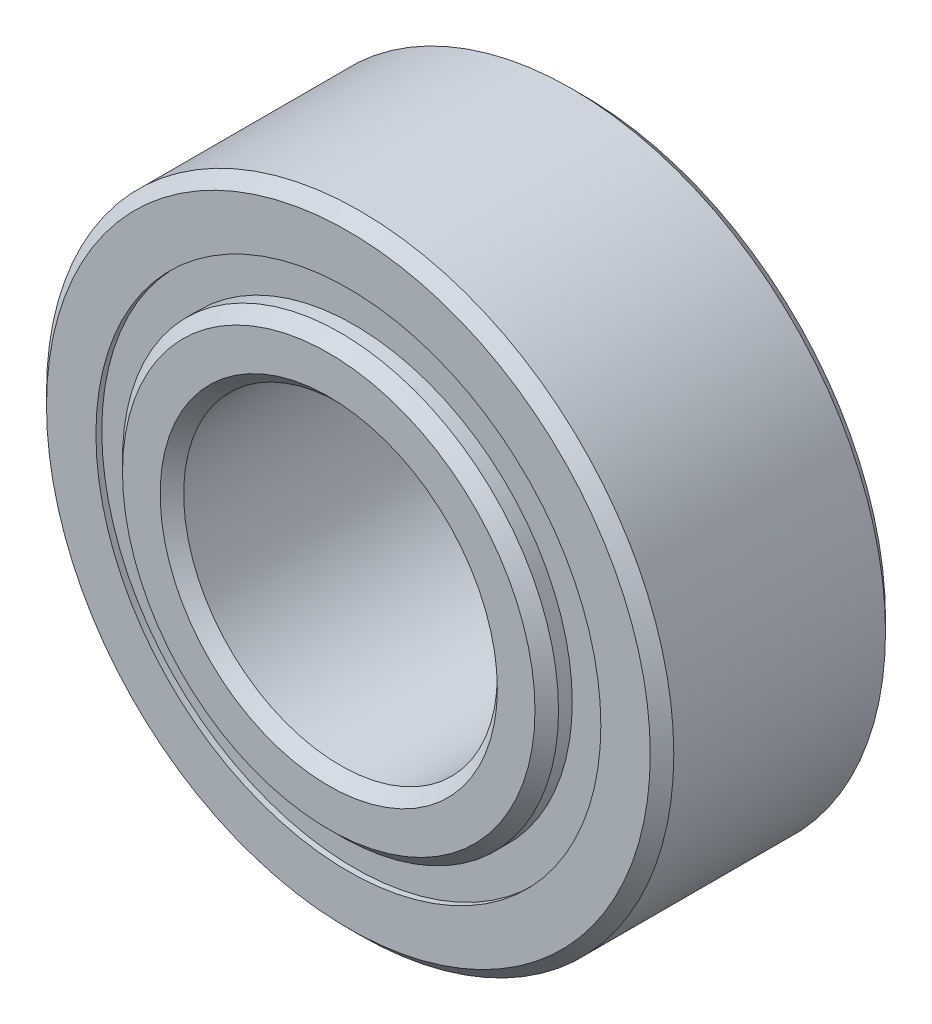
ISO-10303-21;
HEADER;
FILE_DESCRIPTION(('STEP AP214'),'2;1');
FILE_NAME('part.step','',(''),(''),'','','');
FILE_SCHEMA(('AUTOMOTIVE_DESIGN { 1 0 10303 214 1 1 1 1 }'));
ENDSEC;
DATA;
#1=APPLICATION_CONTEXT('core data for automotive mechanical design processes');
#2=APPLICATION_PROTOCOL_DEFINITION('international standard','automotive_design',2000,#1);
#3=PRODUCT_CONTEXT('',#1,'mechanical');
#4=PRODUCT('Part','Part','',(#3));
#5=PRODUCT_RELATED_PRODUCT_CATEGORY('part','',(#4));
#6=PRODUCT_DEFINITION_FORMATION('','',#4);
#7=PRODUCT_DEFINITION_CONTEXT('part definition',#1,'design');
#8=PRODUCT_DEFINITION('design','',#6,#7);
#9=PRODUCT_DEFINITION_SHAPE('','',#8);
#10=(LENGTH_UNIT() NAMED_UNIT(*) SI_UNIT(.MILLI.,.METRE.));
#11=(NAMED_UNIT(*) PLANE_ANGLE_UNIT() SI_UNIT($,.RADIAN.));
#12=(NAMED_UNIT(*) SI_UNIT($,.STERADIAN.) SOLID_ANGLE_UNIT());
#13=UNCERTAINTY_MEASURE_WITH_UNIT(LENGTH_MEASURE(1.E-05),#10,'distance_accuracy_value','');
#14=(GEOMETRIC_REPRESENTATION_CONTEXT(3) GLOBAL_UNCERTAINTY_ASSIGNED_CONTEXT((#13)) GLOBAL_UNIT_ASSIGNED_CONTEXT((#10,
#11,#12)) REPRESENTATION_CONTEXT('',''));
#15=CARTESIAN_POINT('',(0.,0.,0.));
#16=DIRECTION('',(0.,0.,1.));
#17=DIRECTION('',(1.,0.,0.));
#18=AXIS2_PLACEMENT_3D('',#15,#16,#17);
#19=CARTESIAN_POINT('',(0.,5.1114010989011,-2.2621875));
#20=DIRECTION('',(0.,0.,1.));
#21=DIRECTION('',(1.,0.,0.));
#22=AXIS2_PLACEMENT_3D('',#19,#20,#21);
#23=PLANE('',#22);
#24=CARTESIAN_POINT('',(0.,0.,-2.2621875));
#25=DIRECTION('',(0.,0.,1.));
#26=DIRECTION('',(1.,0.,0.));
#27=AXIS2_PLACEMENT_3D('',#24,#25,#26);
#28=CIRCLE('',#27,5.1114010989011);
#29=CARTESIAN_POINT('',(5.1114010989011,0.,-2.2621875));
#30=VERTEX_POINT('',#29);
#31=EDGE_CURVE('E71',#30,#30,#28,.T.);
#32=ORIENTED_EDGE('',*,*,#31,.F.);
#33=EDGE_LOOP('',(#32));
#34=FACE_BOUND('',#33,.T.);
#35=CARTESIAN_POINT('',(0.,0.,-2.2621875));
#36=DIRECTION('',(0.,0.,1.));
#37=DIRECTION('',(1.,0.,0.));
#38=AXIS2_PLACEMENT_3D('',#35,#36,#37);
#39=CIRCLE('',#38,4.41359890109897);
#40=CARTESIAN_POINT('',(4.41359890109897,0.,-2.2621875));
#41=VERTEX_POINT('',#40);
#42=EDGE_CURVE('E13',#41,#41,#39,.T.);
#43=ORIENTED_EDGE('',*,*,#42,.T.);
#44=EDGE_LOOP('',(#43));
#45=FACE_BOUND('',#44,.T.);
#46=ADVANCED_FACE('F57',(#34,#45),#23,.F.);
#47=CARTESIAN_POINT('',(0.,0.,2.38125));
#48=DIRECTION('',(0.,0.,1.));
#49=DIRECTION('',(1.,0.,0.));
#50=AXIS2_PLACEMENT_3D('',#47,#48,#49);
#51=CYLINDRICAL_SURFACE('',#50,4.41359890109897);
#52=ORIENTED_EDGE('',*,*,#42,.F.);
#53=EDGE_LOOP('',(#52));
#54=FACE_BOUND('',#53,.T.);
#55=CARTESIAN_POINT('',(0.,0.,-1.11436144103197));
#56=DIRECTION('',(0.,0.,1.));
#57=DIRECTION('',(1.,0.,0.));
#58=AXIS2_PLACEMENT_3D('',#55,#56,#57);
#59=CIRCLE('',#58,4.41359890109897);
#60=CARTESIAN_POINT('',(4.41359890109897,0.,-1.11436144103197));
#61=VERTEX_POINT('',#60);
#62=EDGE_CURVE('E63',#61,#61,#59,.T.);
#63=ORIENTED_EDGE('',*,*,#62,.T.);
#64=EDGE_LOOP('',(#63));
#65=FACE_BOUND('',#64,.T.);
#66=ADVANCED_FACE('F80',(#54,#65),#51,.F.);
#67=CARTESIAN_POINT('',(0.,5.1114010989011,-1.11436144103197));
#68=DIRECTION('',(0.,0.,-1.));
#69=DIRECTION('',(-1.,0.,0.));
#70=AXIS2_PLACEMENT_3D('',#67,#68,#69);
#71=PLANE('',#70);
#72=ORIENTED_EDGE('',*,*,#62,.F.);
#73=EDGE_LOOP('',(#72));
#74=FACE_BOUND('',#73,.T.);
#75=CARTESIAN_POINT('',(0.,0.,-1.11436144103197));
#76=DIRECTION('',(0.,0.,1.));
#77=DIRECTION('',(1.,0.,0.));
#78=AXIS2_PLACEMENT_3D('',#75,#76,#77);
#79=CIRCLE('',#78,5.1114010989011);
#80=CARTESIAN_POINT('',(5.1114010989011,0.,-1.11436144103197));
#81=VERTEX_POINT('',#80);
#82=EDGE_CURVE('E67',#81,#81,#79,.T.);
#83=ORIENTED_EDGE('',*,*,#82,.T.);
#84=EDGE_LOOP('',(#83));
#85=FACE_BOUND('',#84,.T.);
#86=ADVANCED_FACE('F84',(#74,#85),#71,.F.);
#87=CARTESIAN_POINT('',(0.,0.,2.38125));
#88=DIRECTION('',(0.,0.,1.));
#89=DIRECTION('',(1.,0.,0.));
#90=AXIS2_PLACEMENT_3D('',#87,#88,#89);
#91=CYLINDRICAL_SURFACE('',#90,5.1114010989011);
#92=ORIENTED_EDGE('',*,*,#82,.F.);
#93=EDGE_LOOP('',(#92));
#94=FACE_BOUND('',#93,.T.);
#95=ORIENTED_EDGE('',*,*,#31,.T.);
#96=EDGE_LOOP('',(#95));
#97=FACE_BOUND('',#96,.T.);
#98=ADVANCED_FACE('F77',(#94,#97),#91,.T.);
#99=CLOSED_SHELL('',(#46,#66,#86,#98));
#100=MANIFOLD_SOLID_BREP('B2',#99);
#101=CARTESIAN_POINT('',(0.,5.1114010989011,2.2621875));
#102=DIRECTION('',(0.,0.,-1.));
#103=DIRECTION('',(-1.,0.,0.));
#104=AXIS2_PLACEMENT_3D('',#101,#102,#103);
#105=PLANE('',#104);
#106=CARTESIAN_POINT('',(0.,0.,2.2621875));
#107=DIRECTION('',(0.,0.,1.));
#108=DIRECTION('',(1.,0.,0.));
#109=AXIS2_PLACEMENT_3D('',#106,#107,#108);
#110=CIRCLE('',#109,4.41359890109897);
#111=CARTESIAN_POINT('',(4.41359890109897,0.,2.2621875));
#112=VERTEX_POINT('',#111);
#113=EDGE_CURVE('E56',#112,#112,#110,.T.);
#114=ORIENTED_EDGE('',*,*,#113,.F.);
#115=EDGE_LOOP('',(#114));
#116=FACE_BOUND('',#115,.T.);
#117=CARTESIAN_POINT('',(0.,0.,2.2621875));
#118=DIRECTION('',(0.,0.,1.));
#119=DIRECTION('',(1.,0.,0.));
#120=AXIS2_PLACEMENT_3D('',#117,#118,#119);
#121=CIRCLE('',#120,5.1114010989011);
#122=CARTESIAN_POINT('',(5.1114010989011,0.,2.2621875));
#123=VERTEX_POINT('',#122);
#124=EDGE_CURVE('E145',#123,#123,#121,.T.);
#125=ORIENTED_EDGE('',*,*,#124,.T.);
#126=EDGE_LOOP('',(#125));
#127=FACE_BOUND('',#126,.T.);
#128=ADVANCED_FACE('F131',(#116,#127),#105,.F.);
#129=CARTESIAN_POINT('',(0.,0.,2.38125));
#130=DIRECTION('',(0.,0.,1.));
#131=DIRECTION('',(1.,0.,0.));
#132=AXIS2_PLACEMENT_3D('',#129,#130,#131);
#133=CYLINDRICAL_SURFACE('',#132,4.41359890109897);
#134=CARTESIAN_POINT('',(0.,0.,1.11436144103197));
#135=DIRECTION('',(0.,0.,1.));
#136=DIRECTION('',(1.,0.,0.));
#137=AXIS2_PLACEMENT_3D('',#134,#135,#136);
#138=CIRCLE('',#137,4.41359890109897);
#139=CARTESIAN_POINT('',(4.41359890109897,0.,1.11436144103197));
#140=VERTEX_POINT('',#139);
#141=EDGE_CURVE('E137',#140,#140,#138,.T.);
#142=ORIENTED_EDGE('',*,*,#141,.F.);
#143=EDGE_LOOP('',(#142));
#144=FACE_BOUND('',#143,.T.);
#145=ORIENTED_EDGE('',*,*,#113,.T.);
#146=EDGE_LOOP('',(#145));
#147=FACE_BOUND('',#146,.T.);
#148=ADVANCED_FACE('F160',(#144,#147),#133,.F.);
#149=CARTESIAN_POINT('',(0.,5.1114010989011,1.11436144103197));
#150=DIRECTION('',(0.,0.,1.));
#151=DIRECTION('',(1.,0.,0.));
#152=AXIS2_PLACEMENT_3D('',#149,#150,#151);
#153=PLANE('',#152);
#154=CARTESIAN_POINT('',(0.,0.,1.11436144103197));
#155=DIRECTION('',(0.,0.,1.));
#156=DIRECTION('',(1.,0.,0.));
#157=AXIS2_PLACEMENT_3D('',#154,#155,#156);
#158=CIRCLE('',#157,5.1114010989011);
#159=CARTESIAN_POINT('',(5.1114010989011,0.,1.11436144103197));
#160=VERTEX_POINT('',#159);
#161=EDGE_CURVE('E141',#160,#160,#158,.T.);
#162=ORIENTED_EDGE('',*,*,#161,.F.);
#163=EDGE_LOOP('',(#162));
#164=FACE_BOUND('',#163,.T.);
#165=ORIENTED_EDGE('',*,*,#141,.T.);
#166=EDGE_LOOP('',(#165));
#167=FACE_BOUND('',#166,.T.);
#168=ADVANCED_FACE('F155',(#164,#167),#153,.F.);
#169=CARTESIAN_POINT('',(0.,0.,2.38125));
#170=DIRECTION('',(0.,0.,1.));
#171=DIRECTION('',(1.,0.,0.));
#172=AXIS2_PLACEMENT_3D('',#169,#170,#171);
#173=CYLINDRICAL_SURFACE('',#172,5.1114010989011);
#174=ORIENTED_EDGE('',*,*,#124,.F.);
#175=EDGE_LOOP('',(#174));
#176=FACE_BOUND('',#175,.T.);
#177=ORIENTED_EDGE('',*,*,#161,.T.);
#178=EDGE_LOOP('',(#177));
#179=FACE_BOUND('',#178,.T.);
#180=ADVANCED_FACE('F152',(#176,#179),#173,.T.);
#181=CLOSED_SHELL('',(#128,#148,#168,#180));
#182=MANIFOLD_SOLID_BREP('B8',#181);
#183=CARTESIAN_POINT('',(-2.79932726404285,3.85294343571072,0.));
#184=DIRECTION('',(0.,0.,1.));
#185=DIRECTION('',(-0.587785252292462,0.809016994374955,0.));
#186=AXIS2_PLACEMENT_3D('',#183,#184,#185);
#187=SPHERICAL_SURFACE('',#186,1.11436144103197);
#188=CARTESIAN_POINT('',(-2.79932726404285,3.85294343571072,1.11436144103197));
#189=VERTEX_POINT('',#188);
#190=VERTEX_LOOP('',#189);
#191=FACE_BOUND('',#190,.T.);
#192=ADVANCED_FACE('F203',(#191),#187,.T.);
#193=CLOSED_SHELL('',(#192));
#194=MANIFOLD_SOLID_BREP('B51',#193);
#195=CARTESIAN_POINT('',(-4.52940665885565,1.47169343571074,0.));
#196=DIRECTION('',(0.,0.,1.));
#197=DIRECTION('',(-0.95105651629515,0.309016994374958,0.));
#198=AXIS2_PLACEMENT_3D('',#195,#196,#197);
#199=SPHERICAL_SURFACE('',#198,1.11436144103197);
#200=CARTESIAN_POINT('',(-4.52940665885565,1.47169343571074,1.11436144103197));
#201=VERTEX_POINT('',#200);
#202=VERTEX_LOOP('',#201);
#203=FACE_BOUND('',#202,.T.);
#204=ADVANCED_FACE('F228',(#203),#199,.T.);
#205=CLOSED_SHELL('',(#204));
#206=MANIFOLD_SOLID_BREP('B127',#205);
#207=CARTESIAN_POINT('',(-4.52940665885568,-1.47169343571064,0.));
#208=DIRECTION('',(0.,0.,1.));
#209=DIRECTION('',(-0.951056516295157,-0.309016994374938,0.));
#210=AXIS2_PLACEMENT_3D('',#207,#208,#209);
#211=SPHERICAL_SURFACE('',#210,1.11436144103197);
#212=CARTESIAN_POINT('',(-4.52940665885568,-1.47169343571064,1.11436144103197));
#213=VERTEX_POINT('',#212);
#214=VERTEX_LOOP('',#213);
#215=FACE_BOUND('',#214,.T.);
#216=ADVANCED_FACE('F253',(#215),#211,.T.);
#217=CLOSED_SHELL('',(#216));
#218=MANIFOLD_SOLID_BREP('B199',#217);
#219=CARTESIAN_POINT('',(-2.79932726404294,-3.85294343571066,0.));
#220=DIRECTION('',(0.,0.,1.));
#221=DIRECTION('',(-0.58778525229248,-0.809016994374942,0.));
#222=AXIS2_PLACEMENT_3D('',#219,#220,#221);
#223=SPHERICAL_SURFACE('',#222,1.11436144103197);
#224=CARTESIAN_POINT('',(-2.79932726404294,-3.85294343571066,1.11436144103197));
#225=VERTEX_POINT('',#224);
#226=VERTEX_LOOP('',#225);
#227=FACE_BOUND('',#226,.T.);
#228=ADVANCED_FACE('F277',(#227),#223,.T.);
#229=CLOSED_SHELL('',(#228));
#230=MANIFOLD_SOLID_BREP('B224',#229);
#231=CARTESIAN_POINT('',(0.,-4.7625,0.));
#232=DIRECTION('',(0.,0.,1.));
#233=DIRECTION('',(0.,-1.,0.));
#234=AXIS2_PLACEMENT_3D('',#231,#232,#233);
#235=SPHERICAL_SURFACE('',#234,1.11436144103197);
#236=CARTESIAN_POINT('',(0.,-4.7625,1.11436144103197));
#237=VERTEX_POINT('',#236);
#238=VERTEX_LOOP('',#237);
#239=FACE_BOUND('',#238,.T.);
#240=ADVANCED_FACE('F301',(#239),#235,.T.);
#241=CLOSED_SHELL('',(#240));
#242=MANIFOLD_SOLID_BREP('B249',#241);
#243=CARTESIAN_POINT('',(2.79932726404288,-3.8529434357107,0.));
#244=DIRECTION('',(0.,0.,1.));
#245=DIRECTION('',(0.587785252292469,-0.809016994374951,0.));
#246=AXIS2_PLACEMENT_3D('',#243,#244,#245);
#247=SPHERICAL_SURFACE('',#246,1.11436144103197);
#248=CARTESIAN_POINT('',(2.79932726404288,-3.8529434357107,1.11436144103197));
#249=VERTEX_POINT('',#248);
#250=VERTEX_LOOP('',#249);
#251=FACE_BOUND('',#250,.T.);
#252=ADVANCED_FACE('F326',(#251),#247,.T.);
#253=CLOSED_SHELL('',(#252));
#254=MANIFOLD_SOLID_BREP('B273',#253);
#255=CARTESIAN_POINT('',(4.52940665885566,-1.47169343571071,0.));
#256=DIRECTION('',(0.,0.,1.));
#257=DIRECTION('',(0.951056516295152,-0.309016994374952,0.));
#258=AXIS2_PLACEMENT_3D('',#255,#256,#257);
#259=SPHERICAL_SURFACE('',#258,1.11436144103197);
#260=CARTESIAN_POINT('',(4.52940665885566,-1.47169343571071,1.11436144103197));
#261=VERTEX_POINT('',#260);
#262=VERTEX_LOOP('',#261);
#263=FACE_BOUND('',#262,.T.);
#264=ADVANCED_FACE('F350',(#263),#259,.T.);
#265=CLOSED_SHELL('',(#264));
#266=MANIFOLD_SOLID_BREP('B297',#265);
#267=CARTESIAN_POINT('',(4.52940665885567,1.47169343571067,0.));
#268=DIRECTION('',(0.,0.,1.));
#269=DIRECTION('',(0.951056516295155,0.309016994374945,0.));
#270=AXIS2_PLACEMENT_3D('',#267,#268,#269);
#271=SPHERICAL_SURFACE('',#270,1.11436144103197);
#272=CARTESIAN_POINT('',(4.52940665885567,1.47169343571067,1.11436144103197));
#273=VERTEX_POINT('',#272);
#274=VERTEX_LOOP('',#273);
#275=FACE_BOUND('',#274,.T.);
#276=ADVANCED_FACE('F375',(#275),#271,.T.);
#277=CLOSED_SHELL('',(#276));
#278=MANIFOLD_SOLID_BREP('B322',#277);
#279=CARTESIAN_POINT('',(2.79932726404291,3.85294343571068,0.));
#280=DIRECTION('',(0.,0.,1.));
#281=DIRECTION('',(0.587785252292474,0.809016994374947,0.));
#282=AXIS2_PLACEMENT_3D('',#279,#280,#281);
#283=SPHERICAL_SURFACE('',#282,1.11436144103197);
#284=CARTESIAN_POINT('',(2.79932726404291,3.85294343571068,1.11436144103197));
#285=VERTEX_POINT('',#284);
#286=VERTEX_LOOP('',#285);
#287=FACE_BOUND('',#286,.T.);
#288=ADVANCED_FACE('F400',(#287),#283,.T.);
#289=CLOSED_SHELL('',(#288));
#290=MANIFOLD_SOLID_BREP('B346',#289);
#291=CARTESIAN_POINT('',(0.,4.7625,0.));
#292=DIRECTION('',(0.,0.,1.));
#293=DIRECTION('',(0.,1.,0.));
#294=AXIS2_PLACEMENT_3D('',#291,#292,#293);
#295=SPHERICAL_SURFACE('',#294,1.11436144103197);
#296=CARTESIAN_POINT('',(0.,4.7625,1.11436144103197));
#297=VERTEX_POINT('',#296);
#298=VERTEX_LOOP('',#297);
#299=FACE_BOUND('',#298,.T.);
#300=ADVANCED_FACE('F428',(#299),#295,.T.);
#301=CLOSED_SHELL('',(#300));
#302=MANIFOLD_SOLID_BREP('B371',#301);
#303=CARTESIAN_POINT('',(0.,0.,2.540635));
#304=DIRECTION('',(0.,0.,-1.));
#305=DIRECTION('',(-1.,0.,0.));
#306=AXIS2_PLACEMENT_3D('',#303,#304,#305);
#307=CONICAL_SURFACE('',#306,4.41359890109897,0.785398163397447);
#308=CARTESIAN_POINT('',(0.,0.,2.77876));
#309=DIRECTION('',(0.,0.,1.));
#310=DIRECTION('',(1.,0.,0.));
#311=AXIS2_PLACEMENT_3D('',#308,#309,#310);
#312=CIRCLE('',#311,4.17547390109897);
#313=CARTESIAN_POINT('',(4.17547390109897,0.,2.77876));
#314=VERTEX_POINT('',#313);
#315=EDGE_CURVE('E489',#314,#314,#312,.T.);
#316=ORIENTED_EDGE('',*,*,#315,.F.);
#317=EDGE_LOOP('',(#316));
#318=FACE_BOUND('',#317,.T.);
#319=CARTESIAN_POINT('',(0.,0.,2.540635));
#320=DIRECTION('',(0.,0.,1.));
#321=DIRECTION('',(1.,0.,0.));
#322=AXIS2_PLACEMENT_3D('',#319,#320,#321);
#323=CIRCLE('',#322,4.41359890109897);
#324=CARTESIAN_POINT('',(4.41359890109897,0.,2.540635));
#325=VERTEX_POINT('',#324);
#326=EDGE_CURVE('E427',#325,#325,#323,.T.);
#327=ORIENTED_EDGE('',*,*,#326,.T.);
#328=EDGE_LOOP('',(#327));
#329=FACE_BOUND('',#328,.T.);
#330=ADVANCED_FACE('F455',(#318,#329),#307,.T.);
#331=CARTESIAN_POINT('',(0.,0.,2.38125));
#332=DIRECTION('',(0.,0.,1.));
#333=DIRECTION('',(1.,0.,0.));
#334=AXIS2_PLACEMENT_3D('',#331,#332,#333);
#335=CYLINDRICAL_SURFACE('',#334,4.41359890109897);
#336=ORIENTED_EDGE('',*,*,#326,.F.);
#337=EDGE_LOOP('',(#336));
#338=FACE_BOUND('',#337,.T.);
#339=CARTESIAN_POINT('',(0.,0.,1.05833333333333));
#340=DIRECTION('',(0.,0.,1.));
#341=DIRECTION('',(1.,0.,0.));
#342=AXIS2_PLACEMENT_3D('',#339,#340,#341);
#343=CIRCLE('',#342,4.41359890109897);
#344=CARTESIAN_POINT('',(4.41359890109897,0.,1.05833333333333));
#345=VERTEX_POINT('',#344);
#346=EDGE_CURVE('E461',#345,#345,#343,.T.);
#347=ORIENTED_EDGE('',*,*,#346,.T.);
#348=EDGE_LOOP('',(#347));
#349=FACE_BOUND('',#348,.T.);
#350=ADVANCED_FACE('F496',(#338,#349),#335,.T.);
#351=CARTESIAN_POINT('',(0.,0.,0.));
#352=DIRECTION('',(0.,0.,1.));
#353=DIRECTION('',(1.,0.,0.));
#354=AXIS2_PLACEMENT_3D('',#351,#352,#353);
#355=TOROIDAL_SURFACE('',#354,4.76250000000006,1.11436144103196);
#356=ORIENTED_EDGE('',*,*,#346,.F.);
#357=EDGE_LOOP('',(#356));
#358=FACE_BOUND('',#357,.T.);
#359=CARTESIAN_POINT('',(0.,0.,-1.05833333333333));
#360=DIRECTION('',(0.,0.,1.));
#361=DIRECTION('',(1.,0.,0.));
#362=AXIS2_PLACEMENT_3D('',#359,#360,#361);
#363=CIRCLE('',#362,4.41359890109897);
#364=CARTESIAN_POINT('',(4.41359890109897,0.,-1.05833333333333));
#365=VERTEX_POINT('',#364);
#366=EDGE_CURVE('E465',#365,#365,#363,.T.);
#367=ORIENTED_EDGE('',*,*,#366,.T.);
#368=EDGE_LOOP('',(#367));
#369=FACE_BOUND('',#368,.T.);
#370=ADVANCED_FACE('F500',(#358,#369),#355,.F.);
#371=CARTESIAN_POINT('',(0.,0.,2.38125));
#372=DIRECTION('',(0.,0.,1.));
#373=DIRECTION('',(1.,0.,0.));
#374=AXIS2_PLACEMENT_3D('',#371,#372,#373);
#375=CYLINDRICAL_SURFACE('',#374,4.41359890109897);
#376=ORIENTED_EDGE('',*,*,#366,.F.);
#377=EDGE_LOOP('',(#376));
#378=FACE_BOUND('',#377,.T.);
#379=CARTESIAN_POINT('',(0.,0.,-2.540635));
#380=DIRECTION('',(0.,0.,1.));
#381=DIRECTION('',(1.,0.,0.));
#382=AXIS2_PLACEMENT_3D('',#379,#380,#381);
#383=CIRCLE('',#382,4.41359890109897);
#384=CARTESIAN_POINT('',(4.41359890109897,0.,-2.540635));
#385=VERTEX_POINT('',#384);
#386=EDGE_CURVE('E469',#385,#385,#383,.T.);
#387=ORIENTED_EDGE('',*,*,#386,.T.);
#388=EDGE_LOOP('',(#387));
#389=FACE_BOUND('',#388,.T.);
#390=ADVANCED_FACE('F505',(#378,#389),#375,.T.);
#391=CARTESIAN_POINT('',(0.,0.,-2.77876));
#392=DIRECTION('',(0.,0.,1.));
#393=DIRECTION('',(1.,0.,0.));
#394=AXIS2_PLACEMENT_3D('',#391,#392,#393);
#395=CONICAL_SURFACE('',#394,4.17547390109897,0.785398163397447);
#396=ORIENTED_EDGE('',*,*,#386,.F.);
#397=EDGE_LOOP('',(#396));
#398=FACE_BOUND('',#397,.T.);
#399=CARTESIAN_POINT('',(0.,0.,-2.77876));
#400=DIRECTION('',(0.,0.,1.));
#401=DIRECTION('',(1.,0.,0.));
#402=AXIS2_PLACEMENT_3D('',#399,#400,#401);
#403=CIRCLE('',#402,4.17547390109897);
#404=CARTESIAN_POINT('',(4.17547390109897,0.,-2.77876));
#405=VERTEX_POINT('',#404);
#406=EDGE_CURVE('E474',#405,#405,#403,.T.);
#407=ORIENTED_EDGE('',*,*,#406,.T.);
#408=EDGE_LOOP('',(#407));
#409=FACE_BOUND('',#408,.T.);
#410=ADVANCED_FACE('F511',(#398,#409),#395,.T.);
#411=CARTESIAN_POINT('',(0.,4.17547390109897,-2.77876));
#412=DIRECTION('',(0.,0.,1.));
#413=DIRECTION('',(1.,0.,0.));
#414=AXIS2_PLACEMENT_3D('',#411,#412,#413);
#415=PLANE('',#414);
#416=ORIENTED_EDGE('',*,*,#406,.F.);
#417=EDGE_LOOP('',(#416));
#418=FACE_BOUND('',#417,.T.);
#419=CARTESIAN_POINT('',(0.,0.,-2.77876));
#420=DIRECTION('',(0.,0.,1.));
#421=DIRECTION('',(1.,0.,0.));
#422=AXIS2_PLACEMENT_3D('',#419,#420,#421);
#423=CIRCLE('',#422,3.41312500000007);
#424=CARTESIAN_POINT('',(3.41312500000007,0.,-2.77876));
#425=VERTEX_POINT('',#424);
#426=EDGE_CURVE('E477',#425,#425,#423,.T.);
#427=ORIENTED_EDGE('',*,*,#426,.T.);
#428=EDGE_LOOP('',(#427));
#429=FACE_BOUND('',#428,.T.);
#430=ADVANCED_FACE('F515',(#418,#429),#415,.F.);
#431=CARTESIAN_POINT('',(0.,0.,-2.540635));
#432=DIRECTION('',(0.,0.,-1.));
#433=DIRECTION('',(-1.,0.,0.));
#434=AXIS2_PLACEMENT_3D('',#431,#432,#433);
#435=CONICAL_SURFACE('',#434,3.17500000000007,0.785398163397447);
#436=ORIENTED_EDGE('',*,*,#426,.F.);
#437=EDGE_LOOP('',(#436));
#438=FACE_BOUND('',#437,.T.);
#439=CARTESIAN_POINT('',(0.,0.,-2.540635));
#440=DIRECTION('',(0.,0.,1.));
#441=DIRECTION('',(1.,0.,0.));
#442=AXIS2_PLACEMENT_3D('',#439,#440,#441);
#443=CIRCLE('',#442,3.17500000000007);
#444=CARTESIAN_POINT('',(3.17500000000007,0.,-2.540635));
#445=VERTEX_POINT('',#444);
#446=EDGE_CURVE('E480',#445,#445,#443,.T.);
#447=ORIENTED_EDGE('',*,*,#446,.T.);
#448=EDGE_LOOP('',(#447));
#449=FACE_BOUND('',#448,.T.);
#450=ADVANCED_FACE('F519',(#438,#449),#435,.F.);
#451=CARTESIAN_POINT('',(0.,0.,2.38125));
#452=DIRECTION('',(0.,0.,1.));
#453=DIRECTION('',(1.,0.,0.));
#454=AXIS2_PLACEMENT_3D('',#451,#452,#453);
#455=CYLINDRICAL_SURFACE('',#454,3.17500000000007);
#456=ORIENTED_EDGE('',*,*,#446,.F.);
#457=EDGE_LOOP('',(#456));
#458=FACE_BOUND('',#457,.T.);
#459=CARTESIAN_POINT('',(0.,0.,2.540635));
#460=DIRECTION('',(0.,0.,1.));
#461=DIRECTION('',(1.,0.,0.));
#462=AXIS2_PLACEMENT_3D('',#459,#460,#461);
#463=CIRCLE('',#462,3.17500000000007);
#464=CARTESIAN_POINT('',(3.17500000000007,0.,2.540635));
#465=VERTEX_POINT('',#464);
#466=EDGE_CURVE('E483',#465,#465,#463,.T.);
#467=ORIENTED_EDGE('',*,*,#466,.T.);
#468=EDGE_LOOP('',(#467));
#469=FACE_BOUND('',#468,.T.);
#470=ADVANCED_FACE('F523',(#458,#469),#455,.F.);
#471=CARTESIAN_POINT('',(0.,0.,2.77876));
#472=DIRECTION('',(0.,0.,1.));
#473=DIRECTION('',(1.,0.,0.));
#474=AXIS2_PLACEMENT_3D('',#471,#472,#473);
#475=CONICAL_SURFACE('',#474,3.41312500000007,0.78539816339745);
#476=ORIENTED_EDGE('',*,*,#466,.F.);
#477=EDGE_LOOP('',(#476));
#478=FACE_BOUND('',#477,.T.);
#479=CARTESIAN_POINT('',(0.,0.,2.77876));
#480=DIRECTION('',(0.,0.,1.));
#481=DIRECTION('',(1.,0.,0.));
#482=AXIS2_PLACEMENT_3D('',#479,#480,#481);
#483=CIRCLE('',#482,3.41312500000007);
#484=CARTESIAN_POINT('',(3.41312500000007,0.,2.77876));
#485=VERTEX_POINT('',#484);
#486=EDGE_CURVE('E486',#485,#485,#483,.T.);
#487=ORIENTED_EDGE('',*,*,#486,.T.);
#488=EDGE_LOOP('',(#487));
#489=FACE_BOUND('',#488,.T.);
#490=ADVANCED_FACE('F527',(#478,#489),#475,.F.);
#491=CARTESIAN_POINT('',(0.,3.41312500000007,2.77876));
#492=DIRECTION('',(0.,0.,-1.));
#493=DIRECTION('',(-1.,0.,0.));
#494=AXIS2_PLACEMENT_3D('',#491,#492,#493);
#495=PLANE('',#494);
#496=ORIENTED_EDGE('',*,*,#486,.F.);
#497=EDGE_LOOP('',(#496));
#498=FACE_BOUND('',#497,.T.);
#499=ORIENTED_EDGE('',*,*,#315,.T.);
#500=EDGE_LOOP('',(#499));
#501=FACE_BOUND('',#500,.T.);
#502=ADVANCED_FACE('F493',(#498,#501),#495,.F.);
#503=CLOSED_SHELL('',(#330,#350,#370,#390,#410,#430,#450,#470,#490,#502));
#504=MANIFOLD_SOLID_BREP('B396',#503);
#505=CARTESIAN_POINT('',(0.,0.,2.143125));
#506=DIRECTION('',(0.,0.,-1.));
#507=DIRECTION('',(-1.,0.,0.));
#508=AXIS2_PLACEMENT_3D('',#505,#506,#507);
#509=CONICAL_SURFACE('',#508,6.35,0.785398163397447);
#510=CARTESIAN_POINT('',(0.,0.,2.38125));
#511=DIRECTION('',(0.,0.,1.));
#512=DIRECTION('',(1.,0.,0.));
#513=AXIS2_PLACEMENT_3D('',#510,#511,#512);
#514=CIRCLE('',#513,6.111875);
#515=CARTESIAN_POINT('',(6.111875,0.,2.38125));
#516=VERTEX_POINT('',#515);
#517=EDGE_CURVE('E640',#516,#516,#514,.T.);
#518=ORIENTED_EDGE('',*,*,#517,.F.);
#519=EDGE_LOOP('',(#518));
#520=FACE_BOUND('',#519,.T.);
#521=CARTESIAN_POINT('',(0.,0.,2.143125));
#522=DIRECTION('',(0.,0.,1.));
#523=DIRECTION('',(1.,0.,0.));
#524=AXIS2_PLACEMENT_3D('',#521,#522,#523);
#525=CIRCLE('',#524,6.35);
#526=CARTESIAN_POINT('',(6.35,0.,2.143125));
#527=VERTEX_POINT('',#526);
#528=EDGE_CURVE('E454',#527,#527,#525,.T.);
#529=ORIENTED_EDGE('',*,*,#528,.T.);
#530=EDGE_LOOP('',(#529));
#531=FACE_BOUND('',#530,.T.);
#532=ADVANCED_FACE('F612',(#520,#531),#509,.T.);
#533=CARTESIAN_POINT('',(0.,0.,2.38125));
#534=DIRECTION('',(0.,0.,1.));
#535=DIRECTION('',(1.,0.,0.));
#536=AXIS2_PLACEMENT_3D('',#533,#534,#535);
#537=CYLINDRICAL_SURFACE('',#536,6.35);
#538=ORIENTED_EDGE('',*,*,#528,.F.);
#539=EDGE_LOOP('',(#538));
#540=FACE_BOUND('',#539,.T.);
#541=CARTESIAN_POINT('',(0.,0.,-2.143125));
#542=DIRECTION('',(0.,0.,1.));
#543=DIRECTION('',(1.,0.,0.));
#544=AXIS2_PLACEMENT_3D('',#541,#542,#543);
#545=CIRCLE('',#544,6.35);
#546=CARTESIAN_POINT('',(6.35,0.,-2.143125));
#547=VERTEX_POINT('',#546);
#548=EDGE_CURVE('E618',#547,#547,#545,.T.);
#549=ORIENTED_EDGE('',*,*,#548,.T.);
#550=EDGE_LOOP('',(#549));
#551=FACE_BOUND('',#550,.T.);
#552=ADVANCED_FACE('F647',(#540,#551),#537,.T.);
#553=CARTESIAN_POINT('',(0.,0.,-2.38125));
#554=DIRECTION('',(0.,0.,1.));
#555=DIRECTION('',(1.,0.,0.));
#556=AXIS2_PLACEMENT_3D('',#553,#554,#555);
#557=CONICAL_SURFACE('',#556,6.111875,0.785398163397445);
#558=ORIENTED_EDGE('',*,*,#548,.F.);
#559=EDGE_LOOP('',(#558));
#560=FACE_BOUND('',#559,.T.);
#561=CARTESIAN_POINT('',(0.,0.,-2.38125));
#562=DIRECTION('',(0.,0.,1.));
#563=DIRECTION('',(1.,0.,0.));
#564=AXIS2_PLACEMENT_3D('',#561,#562,#563);
#565=CIRCLE('',#564,6.111875);
#566=CARTESIAN_POINT('',(6.111875,0.,-2.38125));
#567=VERTEX_POINT('',#566);
#568=EDGE_CURVE('E622',#567,#567,#565,.T.);
#569=ORIENTED_EDGE('',*,*,#568,.T.);
#570=EDGE_LOOP('',(#569));
#571=FACE_BOUND('',#570,.T.);
#572=ADVANCED_FACE('F651',(#560,#571),#557,.T.);
#573=CARTESIAN_POINT('',(0.,6.111875,-2.38125));
#574=DIRECTION('',(0.,0.,1.));
#575=DIRECTION('',(1.,0.,0.));
#576=AXIS2_PLACEMENT_3D('',#573,#574,#575);
#577=PLANE('',#576);
#578=ORIENTED_EDGE('',*,*,#568,.F.);
#579=EDGE_LOOP('',(#578));
#580=FACE_BOUND('',#579,.T.);
#581=CARTESIAN_POINT('',(0.,0.,-2.38125));
#582=DIRECTION('',(0.,0.,1.));
#583=DIRECTION('',(1.,0.,0.));
#584=AXIS2_PLACEMENT_3D('',#581,#582,#583);
#585=CIRCLE('',#584,5.1114010989011);
#586=CARTESIAN_POINT('',(5.1114010989011,0.,-2.38125));
#587=VERTEX_POINT('',#586);
#588=EDGE_CURVE('E626',#587,#587,#585,.T.);
#589=ORIENTED_EDGE('',*,*,#588,.T.);
#590=EDGE_LOOP('',(#589));
#591=FACE_BOUND('',#590,.T.);
#592=ADVANCED_FACE('F656',(#580,#591),#577,.F.);
#593=CARTESIAN_POINT('',(0.,0.,2.38125));
#594=DIRECTION('',(0.,0.,1.));
#595=DIRECTION('',(1.,0.,0.));
#596=AXIS2_PLACEMENT_3D('',#593,#594,#595);
#597=CYLINDRICAL_SURFACE('',#596,5.1114010989011);
#598=ORIENTED_EDGE('',*,*,#588,.F.);
#599=EDGE_LOOP('',(#598));
#600=FACE_BOUND('',#599,.T.);
#601=CARTESIAN_POINT('',(0.,0.,-1.05833333333333));
#602=DIRECTION('',(0.,0.,1.));
#603=DIRECTION('',(1.,0.,0.));
#604=AXIS2_PLACEMENT_3D('',#601,#602,#603);
#605=CIRCLE('',#604,5.1114010989011);
#606=CARTESIAN_POINT('',(5.1114010989011,0.,-1.05833333333333));
#607=VERTEX_POINT('',#606);
#608=EDGE_CURVE('E631',#607,#607,#605,.T.);
#609=ORIENTED_EDGE('',*,*,#608,.T.);
#610=EDGE_LOOP('',(#609));
#611=FACE_BOUND('',#610,.T.);
#612=ADVANCED_FACE('F662',(#600,#611),#597,.F.);
#613=CARTESIAN_POINT('',(0.,0.,0.));
#614=DIRECTION('',(0.,0.,1.));
#615=DIRECTION('',(1.,0.,0.));
#616=AXIS2_PLACEMENT_3D('',#613,#614,#615);
#617=TOROIDAL_SURFACE('',#616,4.7625,1.11436144103197);
#618=ORIENTED_EDGE('',*,*,#608,.F.);
#619=EDGE_LOOP('',(#618));
#620=FACE_BOUND('',#619,.T.);
#621=CARTESIAN_POINT('',(0.,0.,1.05833333333333));
#622=DIRECTION('',(0.,0.,1.));
#623=DIRECTION('',(1.,0.,0.));
#624=AXIS2_PLACEMENT_3D('',#621,#622,#623);
#625=CIRCLE('',#624,5.1114010989011);
#626=CARTESIAN_POINT('',(5.1114010989011,0.,1.05833333333333));
#627=VERTEX_POINT('',#626);
#628=EDGE_CURVE('E634',#627,#627,#625,.T.);
#629=ORIENTED_EDGE('',*,*,#628,.T.);
#630=EDGE_LOOP('',(#629));
#631=FACE_BOUND('',#630,.T.);
#632=ADVANCED_FACE('F666',(#620,#631),#617,.F.);
#633=CARTESIAN_POINT('',(0.,0.,2.38125));
#634=DIRECTION('',(0.,0.,1.));
#635=DIRECTION('',(1.,0.,0.));
#636=AXIS2_PLACEMENT_3D('',#633,#634,#635);
#637=CYLINDRICAL_SURFACE('',#636,5.1114010989011);
#638=ORIENTED_EDGE('',*,*,#628,.F.);
#639=EDGE_LOOP('',(#638));
#640=FACE_BOUND('',#639,.T.);
#641=CARTESIAN_POINT('',(0.,0.,2.38125));
#642=DIRECTION('',(0.,0.,1.));
#643=DIRECTION('',(1.,0.,0.));
#644=AXIS2_PLACEMENT_3D('',#641,#642,#643);
#645=CIRCLE('',#644,5.1114010989011);
#646=CARTESIAN_POINT('',(5.1114010989011,0.,2.38125));
#647=VERTEX_POINT('',#646);
#648=EDGE_CURVE('E637',#647,#647,#645,.T.);
#649=ORIENTED_EDGE('',*,*,#648,.T.);
#650=EDGE_LOOP('',(#649));
#651=FACE_BOUND('',#650,.T.);
#652=ADVANCED_FACE('F670',(#640,#651),#637,.F.);
#653=CARTESIAN_POINT('',(0.,6.111875,2.38125));
#654=DIRECTION('',(0.,0.,-1.));
#655=DIRECTION('',(-1.,0.,0.));
#656=AXIS2_PLACEMENT_3D('',#653,#654,#655);
#657=PLANE('',#656);
#658=ORIENTED_EDGE('',*,*,#648,.F.);
#659=EDGE_LOOP('',(#658));
#660=FACE_BOUND('',#659,.T.);
#661=ORIENTED_EDGE('',*,*,#517,.T.);
#662=EDGE_LOOP('',(#661));
#663=FACE_BOUND('',#662,.T.);
#664=ADVANCED_FACE('F644',(#660,#663),#657,.F.);
#665=CLOSED_SHELL('',(#532,#552,#572,#592,#612,#632,#652,#664));
#666=MANIFOLD_SOLID_BREP('B422',#665);
#667=ADVANCED_BREP_SHAPE_REPRESENTATION('',(#18,#100,#182,#194,#206,#218,#230,#242,#254,#266,
#278,#290,#302,#504,#666),#14);
#668=SHAPE_DEFINITION_REPRESENTATION(#9,#667);
ENDSEC;
END-ISO-10303-21;
